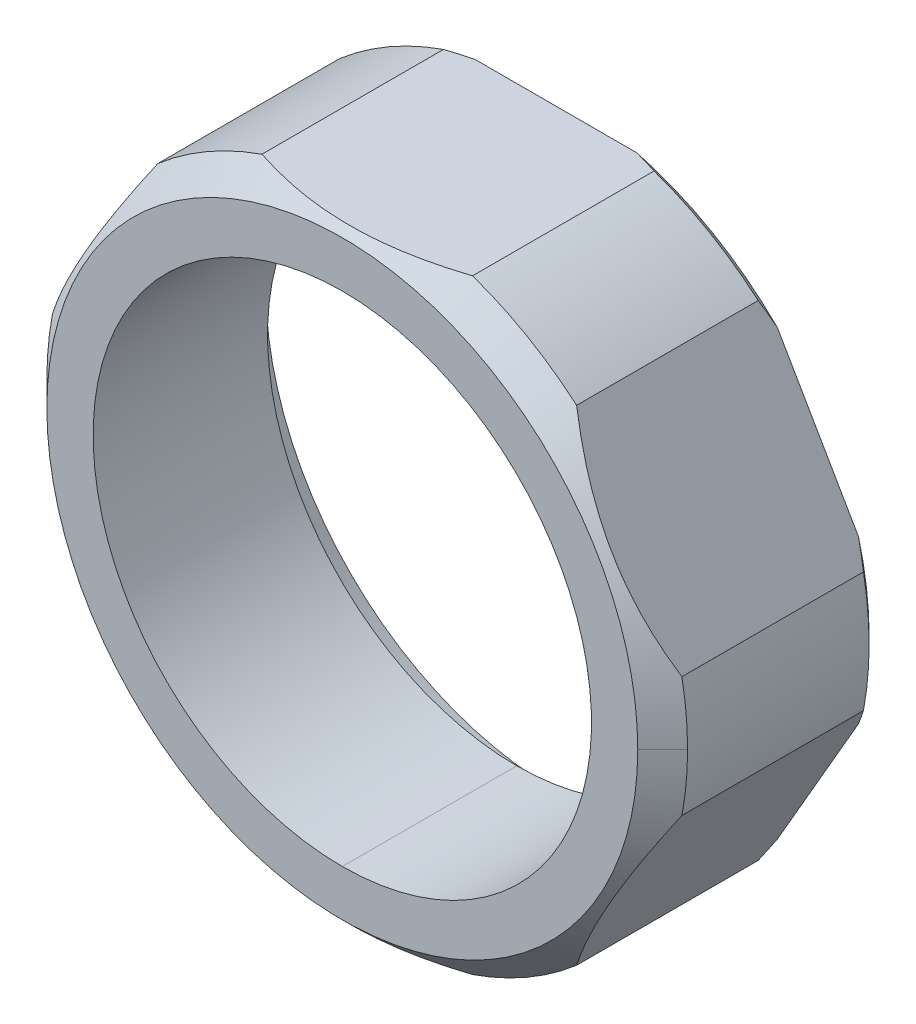
ISO-10303-21;
HEADER;
FILE_DESCRIPTION(('STEP AP214'),'2;1');
FILE_NAME('part.step','',(''),(''),'','','');
FILE_SCHEMA(('AUTOMOTIVE_DESIGN { 1 0 10303 214 1 1 1 1 }'));
ENDSEC;
DATA;
#1=APPLICATION_CONTEXT('core data for automotive mechanical design processes');
#2=APPLICATION_PROTOCOL_DEFINITION('international standard','automotive_design',2000,#1);
#3=PRODUCT_CONTEXT('',#1,'mechanical');
#4=PRODUCT('Part','Part','',(#3));
#5=PRODUCT_RELATED_PRODUCT_CATEGORY('part','',(#4));
#6=PRODUCT_DEFINITION_FORMATION('','',#4);
#7=PRODUCT_DEFINITION_CONTEXT('part definition',#1,'design');
#8=PRODUCT_DEFINITION('design','',#6,#7);
#9=PRODUCT_DEFINITION_SHAPE('','',#8);
#10=(LENGTH_UNIT() NAMED_UNIT(*) SI_UNIT(.MILLI.,.METRE.));
#11=(NAMED_UNIT(*) PLANE_ANGLE_UNIT() SI_UNIT($,.RADIAN.));
#12=(NAMED_UNIT(*) SI_UNIT($,.STERADIAN.) SOLID_ANGLE_UNIT());
#13=UNCERTAINTY_MEASURE_WITH_UNIT(LENGTH_MEASURE(1.E-05),#10,'distance_accuracy_value','');
#14=(GEOMETRIC_REPRESENTATION_CONTEXT(3) GLOBAL_UNCERTAINTY_ASSIGNED_CONTEXT((#13)) GLOBAL_UNIT_ASSIGNED_CONTEXT((#10,
#11,#12)) REPRESENTATION_CONTEXT('',''));
#15=CARTESIAN_POINT('',(0.,0.,0.));
#16=DIRECTION('',(0.,0.,1.));
#17=DIRECTION('',(1.,0.,0.));
#18=AXIS2_PLACEMENT_3D('',#15,#16,#17);
#19=CARTESIAN_POINT('',(0.,0.,-5.45));
#20=DIRECTION('',(0.,0.,-1.));
#21=DIRECTION('',(0.,-1.,0.));
#22=AXIS2_PLACEMENT_3D('',#19,#20,#21);
#23=CONICAL_SURFACE('',#22,8.025,0.223476601140647);
#24=DIRECTION('',(0.,0.22162110358899,-0.975132855791455));
#25=VECTOR('',#24,1.);
#26=CARTESIAN_POINT('',(0.,7.9,-4.9));
#27=LINE('',#26,#25);
#28=CARTESIAN_POINT('',(0.,7.9,-4.9));
#29=VERTEX_POINT('',#28);
#30=CARTESIAN_POINT('',(0.,8.15,-6.));
#31=VERTEX_POINT('',#30);
#32=EDGE_CURVE('E447',#29,#31,#27,.T.);
#33=ORIENTED_EDGE('',*,*,#32,.F.);
#34=CARTESIAN_POINT('',(0.,0.,-4.9));
#35=DIRECTION('',(0.,0.,-1.));
#36=DIRECTION('',(0.,-1.,0.));
#37=AXIS2_PLACEMENT_3D('',#34,#35,#36);
#38=CIRCLE('',#37,7.9);
#39=CARTESIAN_POINT('',(0.,-7.9,-4.9));
#40=VERTEX_POINT('',#39);
#41=EDGE_CURVE('E422',#40,#29,#38,.T.);
#42=ORIENTED_EDGE('',*,*,#41,.F.);
#43=DIRECTION('',(0.,-0.22162110358899,-0.975132855791455));
#44=VECTOR('',#43,1.);
#45=CARTESIAN_POINT('',(0.,-7.9,-4.9));
#46=LINE('',#45,#44);
#47=CARTESIAN_POINT('',(0.,-8.15,-6.));
#48=VERTEX_POINT('',#47);
#49=EDGE_CURVE('E421',#40,#48,#46,.T.);
#50=ORIENTED_EDGE('',*,*,#49,.T.);
#51=CARTESIAN_POINT('',(0.,0.,-6.));
#52=DIRECTION('',(0.,0.,-1.));
#53=DIRECTION('',(0.,-1.,0.));
#54=AXIS2_PLACEMENT_3D('',#51,#52,#53);
#55=CIRCLE('',#54,8.15);
#56=EDGE_CURVE('E505',#48,#31,#55,.T.);
#57=ORIENTED_EDGE('',*,*,#56,.T.);
#58=EDGE_LOOP('',(#33,#42,#50,#57));
#59=FACE_BOUND('',#58,.T.);
#60=ADVANCED_FACE('F17',(#59),#23,.F.);
#61=CARTESIAN_POINT('',(-2.95803989155,8.5,0.));
#62=DIRECTION('',(0.,-1.,0.));
#63=DIRECTION('',(0.,0.,-1.));
#64=AXIS2_PLACEMENT_3D('',#61,#62,#63);
#65=PLANE('',#64);
#66=DIRECTION('',(0.,0.,-1.));
#67=VECTOR('',#66,1.);
#68=CARTESIAN_POINT('',(2.95803989155,8.5,-0.7));
#69=LINE('',#68,#67);
#70=CARTESIAN_POINT('',(2.95803989155,8.5,-0.7));
#71=VERTEX_POINT('',#70);
#72=CARTESIAN_POINT('',(2.95803989155,8.5,-5.8));
#73=VERTEX_POINT('',#72);
#74=EDGE_CURVE('E290',#71,#73,#69,.T.);
#75=ORIENTED_EDGE('',*,*,#74,.T.);
#76=CARTESIAN_POINT('',(2.278157149979,8.5,-6.));
#77=CARTESIAN_POINT('',(2.352907056173,8.5,-5.980648632584));
#78=CARTESIAN_POINT('',(2.502933065639,8.5,-5.940031277948));
#79=CARTESIAN_POINT('',(2.729399049122,8.5,-5.873410688425));
#80=CARTESIAN_POINT('',(2.881633655516,8.5,-5.825112521572));
#81=CARTESIAN_POINT('',(2.95803989155,8.5,-5.8));
#82=(BOUNDED_CURVE() B_SPLINE_CURVE(3,(#76,#77,#78,#79,#80,#81),.UNSPECIFIED.,.F.,
.F.) B_SPLINE_CURVE_WITH_KNOTS((4,1,1,4),(0.,0.3333333333333,0.6666666666667,1.),
.UNSPECIFIED.) CURVE() GEOMETRIC_REPRESENTATION_ITEM() RATIONAL_B_SPLINE_CURVE((1.,1.,1.,1.,1.,1.)) REPRESENTATION_ITEM(''));
#83=CARTESIAN_POINT('',(2.278157149979,8.5,-6.));
#84=VERTEX_POINT('',#83);
#85=EDGE_CURVE('E485',#84,#73,#82,.T.);
#86=ORIENTED_EDGE('',*,*,#85,.F.);
#87=DIRECTION('',(1.,0.,0.));
#88=VECTOR('',#87,1.);
#89=CARTESIAN_POINT('',(-2.278157149979,8.5,-6.));
#90=LINE('',#89,#88);
#91=CARTESIAN_POINT('',(-2.278157149979,8.5,-6.));
#92=VERTEX_POINT('',#91);
#93=EDGE_CURVE('E396',#92,#84,#90,.T.);
#94=ORIENTED_EDGE('',*,*,#93,.F.);
#95=CARTESIAN_POINT('',(-2.95803989155,8.5,-5.8));
#96=CARTESIAN_POINT('',(-2.881606480556,8.5,-5.825121453196));
#97=CARTESIAN_POINT('',(-2.729335310098,8.5,-5.873430376536));
#98=CARTESIAN_POINT('',(-2.502872216259,8.5,-5.940048251835));
#99=CARTESIAN_POINT('',(-2.352880866275,8.5,-5.980655412665));
#100=CARTESIAN_POINT('',(-2.278157149979,8.5,-6.));
#101=(BOUNDED_CURVE() B_SPLINE_CURVE(3,(#95,#96,#97,#98,#99,#100),.UNSPECIFIED.,.F.,
.F.) B_SPLINE_CURVE_WITH_KNOTS((4,1,1,4),(0.,0.3333333333333,0.6666666666667,1.),
.UNSPECIFIED.) CURVE() GEOMETRIC_REPRESENTATION_ITEM() RATIONAL_B_SPLINE_CURVE((1.,1.,1.,1.,1.,1.)) REPRESENTATION_ITEM(''));
#102=CARTESIAN_POINT('',(-2.95803989155,8.5,-5.8));
#103=VERTEX_POINT('',#102);
#104=EDGE_CURVE('E394',#103,#92,#101,.T.);
#105=ORIENTED_EDGE('',*,*,#104,.F.);
#106=DIRECTION('',(0.,0.,-1.));
#107=VECTOR('',#106,1.);
#108=CARTESIAN_POINT('',(-2.95803989155,8.5,-0.7));
#109=LINE('',#108,#107);
#110=CARTESIAN_POINT('',(-2.95803989155,8.5,-0.7));
#111=VERTEX_POINT('',#110);
#112=EDGE_CURVE('E28',#111,#103,#109,.T.);
#113=ORIENTED_EDGE('',*,*,#112,.F.);
#114=CARTESIAN_POINT('',(-2.95803989155,8.5,-0.7));
#115=CARTESIAN_POINT('',(-2.19200036439627,8.5,-0.448224946686156));
#116=CARTESIAN_POINT('',(-1.45843124406096,8.5,-0.324191918908603));
#117=CARTESIAN_POINT('',(-0.724071352409175,8.5,-0.200025186265424));
#118=CARTESIAN_POINT('',(0.000155132986670234,8.5,-0.199992128847245));
#119=CARTESIAN_POINT('',(0.723284600410315,8.5,-0.199959121502604));
#120=CARTESIAN_POINT('',(1.45864079223674,8.5,-0.324226781885833));
#121=CARTESIAN_POINT('',(2.19157506313131,8.5,-0.448085162451768));
#122=CARTESIAN_POINT('',(2.95803989155,8.5,-0.7));
#123=B_SPLINE_CURVE_WITH_KNOTS('',2,(#114,#115,#116,#117,#118,#119,#120,#121,#122),
.UNSPECIFIED.,.F.,.F.,(3,2,2,2,3),(0.,0.25,0.5,0.75,1.),.UNSPECIFIED.);
#124=EDGE_CURVE('E321',#111,#71,#123,.T.);
#125=ORIENTED_EDGE('',*,*,#124,.T.);
#126=EDGE_LOOP('',(#75,#86,#94,#105,#113,#125));
#127=FACE_BOUND('',#126,.T.);
#128=ADVANCED_FACE('F256',(#127),#65,.F.);
#129=CARTESIAN_POINT('',(-8.840235877943,1.68826230851,0.));
#130=DIRECTION('',(0.866025403784429,-0.500000000000017,0.));
#131=DIRECTION('',(0.,0.,-1.));
#132=AXIS2_PLACEMENT_3D('',#129,#130,#131);
#133=PLANE('',#132);
#134=DIRECTION('',(0.,0.,-1.));
#135=VECTOR('',#134,1.);
#136=CARTESIAN_POINT('',(-5.882195986393,6.81173769149,-0.7));
#137=LINE('',#136,#135);
#138=CARTESIAN_POINT('',(-5.882195986393,6.81173769149,-0.7));
#139=VERTEX_POINT('',#138);
#140=CARTESIAN_POINT('',(-5.882195986393,6.81173769149,-5.8));
#141=VERTEX_POINT('',#140);
#142=EDGE_CURVE('E11',#139,#141,#137,.T.);
#143=ORIENTED_EDGE('',*,*,#142,.T.);
#144=CARTESIAN_POINT('',(-6.222137357178,6.222941965695,-6.));
#145=CARTESIAN_POINT('',(-6.184762404081,6.28767728339,-5.980648632584));
#146=CARTESIAN_POINT('',(-6.109749399348,6.417603618815,-5.940031277948));
#147=CARTESIAN_POINT('',(-5.996516407607,6.613728913605,-5.873410688425));
#148=CARTESIAN_POINT('',(-5.92039910441,6.745567950077,-5.825112521572));
#149=CARTESIAN_POINT('',(-5.882195986393,6.81173769149,-5.8));
#150=(BOUNDED_CURVE() B_SPLINE_CURVE(3,(#144,#145,#146,#147,#148,#149),.UNSPECIFIED.,.F.,
.F.) B_SPLINE_CURVE_WITH_KNOTS((4,1,1,4),(0.,0.3333333333333,0.6666666666667,1.),
.UNSPECIFIED.) CURVE() GEOMETRIC_REPRESENTATION_ITEM() RATIONAL_B_SPLINE_CURVE((1.,1.,1.,1.,1.,1.)) REPRESENTATION_ITEM(''));
#151=CARTESIAN_POINT('',(-6.222137357178,6.222941965695,-6.));
#152=VERTEX_POINT('',#151);
#153=EDGE_CURVE('E405',#152,#141,#150,.T.);
#154=ORIENTED_EDGE('',*,*,#153,.F.);
#155=DIRECTION('',(0.500000000000017,0.866025403784429,0.));
#156=VECTOR('',#155,1.);
#157=CARTESIAN_POINT('',(-8.500294507157,2.277058034305,-6.));
#158=LINE('',#157,#156);
#159=CARTESIAN_POINT('',(-8.500294507157,2.277058034305,-6.));
#160=VERTEX_POINT('',#159);
#161=EDGE_CURVE('E518',#160,#152,#158,.T.);
#162=ORIENTED_EDGE('',*,*,#161,.F.);
#163=CARTESIAN_POINT('',(-8.840235877943,1.68826230851,-5.8));
#164=CARTESIAN_POINT('',(-8.802019172446,1.754455584129,-5.825121453196));
#165=CARTESIAN_POINT('',(-8.725883587216,1.88632628601,-5.873430376536));
#166=CARTESIAN_POINT('',(-8.612652040297,2.082449078293,-5.940048251835));
#167=CARTESIAN_POINT('',(-8.537656365305,2.212345397728,-5.980655412665));
#168=CARTESIAN_POINT('',(-8.500294507157,2.277058034305,-6.));
#169=(BOUNDED_CURVE() B_SPLINE_CURVE(3,(#163,#164,#165,#166,#167,#168),.UNSPECIFIED.,.F.,
.F.) B_SPLINE_CURVE_WITH_KNOTS((4,1,1,4),(0.,0.3333333333333,0.6666666666667,1.),
.UNSPECIFIED.) CURVE() GEOMETRIC_REPRESENTATION_ITEM() RATIONAL_B_SPLINE_CURVE((1.,1.,1.,1.,1.,1.)) REPRESENTATION_ITEM(''));
#170=CARTESIAN_POINT('',(-8.840235877943,1.68826230851,-5.8));
#171=VERTEX_POINT('',#170);
#172=EDGE_CURVE('E510',#171,#160,#169,.T.);
#173=ORIENTED_EDGE('',*,*,#172,.F.);
#174=DIRECTION('',(0.,0.,-1.));
#175=VECTOR('',#174,1.);
#176=CARTESIAN_POINT('',(-8.840235877943,1.68826230851,-0.7));
#177=LINE('',#176,#175);
#178=CARTESIAN_POINT('',(-8.840235877943,1.68826230851,-0.7));
#179=VERTEX_POINT('',#178);
#180=EDGE_CURVE('E218',#179,#171,#177,.T.);
#181=ORIENTED_EDGE('',*,*,#180,.F.);
#182=CARTESIAN_POINT('',(-8.840235877943,1.68826230851,-0.7));
#183=CARTESIAN_POINT('',(-8.45721611436658,2.35167199932734,-0.44822494668627));
#184=CARTESIAN_POINT('',(-8.09043155419866,2.98696149296996,-0.324191918908603));
#185=CARTESIAN_POINT('',(-7.72325160837283,3.62293581466065,-0.200025186265424));
#186=CARTESIAN_POINT('',(-7.36113836567474,4.25013434910724,-0.199992128847245));
#187=CARTESIAN_POINT('',(-6.99957363196247,4.87638283812197,-0.199959121502604));
#188=CARTESIAN_POINT('',(-6.63189553604956,5.51321998107328,-0.324226781885833));
#189=CARTESIAN_POINT('',(-6.26542840060295,6.14795967897101,-0.448085162451644));
#190=CARTESIAN_POINT('',(-5.88219598639295,6.81173769148998,-0.7));
#191=B_SPLINE_CURVE_WITH_KNOTS('',2,(#182,#183,#184,#185,#186,#187,#188,#189,#190),
.UNSPECIFIED.,.F.,.F.,(3,2,2,2,3),(0.,0.25,0.5,0.75,1.),.UNSPECIFIED.);
#192=EDGE_CURVE('E238',#179,#139,#191,.T.);
#193=ORIENTED_EDGE('',*,*,#192,.T.);
#194=EDGE_LOOP('',(#143,#154,#162,#173,#181,#193));
#195=FACE_BOUND('',#194,.T.);
#196=ADVANCED_FACE('F245',(#195),#133,.F.);
#197=CARTESIAN_POINT('',(-5.882195986393,-6.81173769149,0.));
#198=DIRECTION('',(0.866025403784429,0.500000000000017,0.));
#199=DIRECTION('',(0.,0.,-1.));
#200=AXIS2_PLACEMENT_3D('',#197,#198,#199);
#201=PLANE('',#200);
#202=DIRECTION('',(0.,0.,-1.));
#203=VECTOR('',#202,1.);
#204=CARTESIAN_POINT('',(-8.840235877943,-1.68826230851,-0.7));
#205=LINE('',#204,#203);
#206=CARTESIAN_POINT('',(-8.840235877943,-1.68826230851,-0.7));
#207=VERTEX_POINT('',#206);
#208=CARTESIAN_POINT('',(-8.840235877943,-1.68826230851,-5.8));
#209=VERTEX_POINT('',#208);
#210=EDGE_CURVE('E221',#207,#209,#205,.T.);
#211=ORIENTED_EDGE('',*,*,#210,.T.);
#212=CARTESIAN_POINT('',(-8.500294507157,-2.277058034305,-6.));
#213=CARTESIAN_POINT('',(-8.537669460254,-2.21232271661,-5.980648632584));
#214=CARTESIAN_POINT('',(-8.612682464987,-2.082396381185,-5.940031277948));
#215=CARTESIAN_POINT('',(-8.725915456729,-1.886271086395,-5.873410688425));
#216=CARTESIAN_POINT('',(-8.802032759926,-1.754432049923,-5.825112521572));
#217=CARTESIAN_POINT('',(-8.840235877943,-1.68826230851,-5.8));
#218=(BOUNDED_CURVE() B_SPLINE_CURVE(3,(#212,#213,#214,#215,#216,#217),.UNSPECIFIED.,.F.,
.F.) B_SPLINE_CURVE_WITH_KNOTS((4,1,1,4),(0.,0.3333333333333,0.6666666666667,1.),
.UNSPECIFIED.) CURVE() GEOMETRIC_REPRESENTATION_ITEM() RATIONAL_B_SPLINE_CURVE((1.,1.,1.,1.,1.,1.)) REPRESENTATION_ITEM(''));
#219=CARTESIAN_POINT('',(-8.500294507157,-2.277058034305,-6.));
#220=VERTEX_POINT('',#219);
#221=EDGE_CURVE('E653',#220,#209,#218,.T.);
#222=ORIENTED_EDGE('',*,*,#221,.F.);
#223=DIRECTION('',(-0.500000000000017,0.866025403784429,0.));
#224=VECTOR('',#223,1.);
#225=CARTESIAN_POINT('',(-6.222137357178,-6.222941965695,-6.));
#226=LINE('',#225,#224);
#227=CARTESIAN_POINT('',(-6.222137357178,-6.222941965695,-6.));
#228=VERTEX_POINT('',#227);
#229=EDGE_CURVE('E440',#228,#220,#226,.T.);
#230=ORIENTED_EDGE('',*,*,#229,.F.);
#231=CARTESIAN_POINT('',(-5.882195986393,-6.81173769149,-5.8));
#232=CARTESIAN_POINT('',(-5.92041269189,-6.745544415871,-5.825121453196));
#233=CARTESIAN_POINT('',(-5.996548277119,-6.61367371399,-5.873430376536));
#234=CARTESIAN_POINT('',(-6.109779824038,-6.417550921707,-5.940048251835));
#235=CARTESIAN_POINT('',(-6.18477549903,-6.287654602272,-5.980655412665));
#236=CARTESIAN_POINT('',(-6.222137357178,-6.222941965695,-6.));
#237=(BOUNDED_CURVE() B_SPLINE_CURVE(3,(#231,#232,#233,#234,#235,#236),.UNSPECIFIED.,.F.,
.F.) B_SPLINE_CURVE_WITH_KNOTS((4,1,1,4),(0.,0.3333333333333,0.6666666666667,1.),
.UNSPECIFIED.) CURVE() GEOMETRIC_REPRESENTATION_ITEM() RATIONAL_B_SPLINE_CURVE((1.,1.,1.,1.,1.,1.)) REPRESENTATION_ITEM(''));
#238=CARTESIAN_POINT('',(-5.882195986393,-6.81173769149,-5.8));
#239=VERTEX_POINT('',#238);
#240=EDGE_CURVE('E503',#239,#228,#237,.T.);
#241=ORIENTED_EDGE('',*,*,#240,.F.);
#242=DIRECTION('',(0.,0.,-1.));
#243=VECTOR('',#242,1.);
#244=CARTESIAN_POINT('',(-5.882195986393,-6.81173769149,-0.7));
#245=LINE('',#244,#243);
#246=CARTESIAN_POINT('',(-5.882195986393,-6.81173769149,-0.7));
#247=VERTEX_POINT('',#246);
#248=EDGE_CURVE('E209',#247,#239,#245,.T.);
#249=ORIENTED_EDGE('',*,*,#248,.F.);
#250=CARTESIAN_POINT('',(-5.882195986393,-6.81173769149,-0.7));
#251=CARTESIAN_POINT('',(-6.26521574996983,-6.14832800067194,-0.448224946685998));
#252=CARTESIAN_POINT('',(-6.63200031013719,-5.5130385070303,-0.324191918908603));
#253=CARTESIAN_POINT('',(-6.99918025596325,-4.8770641853392,-0.200025186265424));
#254=CARTESIAN_POINT('',(-7.36129349866113,-4.24986565089298,-0.199992128847245));
#255=CARTESIAN_POINT('',(-7.72285823237328,-3.62361716187846,-0.199959121502604));
#256=CARTESIAN_POINT('',(-8.09053632828619,-2.98678001892715,-0.324226781885833));
#257=CARTESIAN_POINT('',(-8.45700346373331,-2.35204032102853,-0.448085162451818));
#258=CARTESIAN_POINT('',(-8.84023587794305,-1.68826230851002,-0.7));
#259=B_SPLINE_CURVE_WITH_KNOTS('',2,(#250,#251,#252,#253,#254,#255,#256,#257,#258),
.UNSPECIFIED.,.F.,.F.,(3,2,2,2,3),(0.,0.25,0.5,0.75,1.),.UNSPECIFIED.);
#260=EDGE_CURVE('E229',#247,#207,#259,.T.);
#261=ORIENTED_EDGE('',*,*,#260,.T.);
#262=EDGE_LOOP('',(#211,#222,#230,#241,#249,#261));
#263=FACE_BOUND('',#262,.T.);
#264=ADVANCED_FACE('F255',(#263),#201,.F.);
#265=CARTESIAN_POINT('',(0.,0.,0.3));
#266=DIRECTION('',(0.,0.,-1.));
#267=DIRECTION('',(0.,-1.,0.));
#268=AXIS2_PLACEMENT_3D('',#265,#266,#267);
#269=CYLINDRICAL_SURFACE('',#268,9.);
#270=ORIENTED_EDGE('',*,*,#112,.T.);
#271=CARTESIAN_POINT('',(0.,0.,-5.8));
#272=DIRECTION('',(0.,0.,-1.));
#273=DIRECTION('',(-0.6535773318214,0.7568597434989,0.));
#274=AXIS2_PLACEMENT_3D('',#271,#272,#273);
#275=CIRCLE('',#274,9.);
#276=EDGE_CURVE('E388',#141,#103,#275,.T.);
#277=ORIENTED_EDGE('',*,*,#276,.F.);
#278=ORIENTED_EDGE('',*,*,#142,.F.);
#279=CARTESIAN_POINT('',(0.,0.,-0.7));
#280=DIRECTION('',(0.,0.,-1.));
#281=DIRECTION('',(-0.6535773318214,0.7568597434989,0.));
#282=AXIS2_PLACEMENT_3D('',#279,#280,#281);
#283=CIRCLE('',#282,9.);
#284=EDGE_CURVE('E390',#139,#111,#283,.T.);
#285=ORIENTED_EDGE('',*,*,#284,.T.);
#286=EDGE_LOOP('',(#270,#277,#278,#285));
#287=FACE_BOUND('',#286,.T.);
#288=ADVANCED_FACE('F268',(#287),#269,.T.);
#289=CARTESIAN_POINT('',(0.,0.,0.3));
#290=DIRECTION('',(0.,0.,-1.));
#291=DIRECTION('',(0.,-1.,0.));
#292=AXIS2_PLACEMENT_3D('',#289,#290,#291);
#293=CYLINDRICAL_SURFACE('',#292,9.);
#294=CARTESIAN_POINT('',(0.,0.,-0.7));
#295=DIRECTION('',(0.,0.,-1.));
#296=DIRECTION('',(-1.,0.,0.));
#297=AXIS2_PLACEMENT_3D('',#294,#295,#296);
#298=CIRCLE('',#297,9.);
#299=CARTESIAN_POINT('',(-9.,0.,-0.7));
#300=VERTEX_POINT('',#299);
#301=EDGE_CURVE('E451',#300,#179,#298,.T.);
#302=ORIENTED_EDGE('',*,*,#301,.T.);
#303=ORIENTED_EDGE('',*,*,#180,.T.);
#304=CARTESIAN_POINT('',(0.,0.,-5.8));
#305=DIRECTION('',(0.,0.,1.));
#306=DIRECTION('',(-0.982248430882508,0.187584700945602,0.));
#307=AXIS2_PLACEMENT_3D('',#304,#305,#306);
#308=CIRCLE('',#307,9.);
#309=EDGE_CURVE('E517',#171,#209,#308,.T.);
#310=ORIENTED_EDGE('',*,*,#309,.T.);
#311=ORIENTED_EDGE('',*,*,#210,.F.);
#312=CARTESIAN_POINT('',(0.,0.,-0.7));
#313=DIRECTION('',(0.,0.,-1.));
#314=DIRECTION('',(-0.982248430882508,-0.187584700945602,0.));
#315=AXIS2_PLACEMENT_3D('',#312,#313,#314);
#316=CIRCLE('',#315,9.);
#317=EDGE_CURVE('E226',#207,#300,#316,.T.);
#318=ORIENTED_EDGE('',*,*,#317,.T.);
#319=EDGE_LOOP('',(#302,#303,#310,#311,#318));
#320=FACE_BOUND('',#319,.T.);
#321=ADVANCED_FACE('F19',(#320),#293,.T.);
#322=CARTESIAN_POINT('',(0.,0.,0.3));
#323=DIRECTION('',(0.,0.,-1.));
#324=DIRECTION('',(0.,-1.,0.));
#325=AXIS2_PLACEMENT_3D('',#322,#323,#324);
#326=CYLINDRICAL_SURFACE('',#325,9.);
#327=ORIENTED_EDGE('',*,*,#248,.T.);
#328=CARTESIAN_POINT('',(0.,0.,-5.8));
#329=DIRECTION('',(0.,0.,-1.));
#330=DIRECTION('',(-0.328671099061113,-0.944444444444437,0.));
#331=AXIS2_PLACEMENT_3D('',#328,#329,#330);
#332=CIRCLE('',#331,9.);
#333=CARTESIAN_POINT('',(-2.95803989155,-8.5,-5.8));
#334=VERTEX_POINT('',#333);
#335=EDGE_CURVE('E497',#334,#239,#332,.T.);
#336=ORIENTED_EDGE('',*,*,#335,.F.);
#337=DIRECTION('',(0.,0.,-1.));
#338=VECTOR('',#337,1.);
#339=CARTESIAN_POINT('',(-2.95803989155,-8.5,-0.7));
#340=LINE('',#339,#338);
#341=CARTESIAN_POINT('',(-2.95803989155,-8.5,-0.7));
#342=VERTEX_POINT('',#341);
#343=EDGE_CURVE('E133',#342,#334,#340,.T.);
#344=ORIENTED_EDGE('',*,*,#343,.F.);
#345=CARTESIAN_POINT('',(0.,0.,-0.7));
#346=DIRECTION('',(0.,0.,-1.));
#347=DIRECTION('',(-0.328671099061113,-0.944444444444437,0.));
#348=AXIS2_PLACEMENT_3D('',#345,#346,#347);
#349=CIRCLE('',#348,9.);
#350=EDGE_CURVE('E169',#342,#247,#349,.T.);
#351=ORIENTED_EDGE('',*,*,#350,.T.);
#352=EDGE_LOOP('',(#327,#336,#344,#351));
#353=FACE_BOUND('',#352,.T.);
#354=ADVANCED_FACE('F257',(#353),#326,.T.);
#355=CARTESIAN_POINT('',(2.95803989155,-8.5,0.));
#356=DIRECTION('',(0.,1.,0.));
#357=DIRECTION('',(1.,0.,0.));
#358=AXIS2_PLACEMENT_3D('',#355,#356,#357);
#359=PLANE('',#358);
#360=ORIENTED_EDGE('',*,*,#343,.T.);
#361=CARTESIAN_POINT('',(-2.278157149979,-8.5,-6.));
#362=CARTESIAN_POINT('',(-2.352907056173,-8.5,-5.980648632584));
#363=CARTESIAN_POINT('',(-2.502933065639,-8.5,-5.940031277948));
#364=CARTESIAN_POINT('',(-2.729399049122,-8.5,-5.873410688425));
#365=CARTESIAN_POINT('',(-2.881633655516,-8.5,-5.825112521572));
#366=CARTESIAN_POINT('',(-2.95803989155,-8.5,-5.8));
#367=(BOUNDED_CURVE() B_SPLINE_CURVE(3,(#361,#362,#363,#364,#365,#366),.UNSPECIFIED.,.F.,
.F.) B_SPLINE_CURVE_WITH_KNOTS((4,1,1,4),(0.,0.3333333333333,0.6666666666667,1.),
.UNSPECIFIED.) CURVE() GEOMETRIC_REPRESENTATION_ITEM() RATIONAL_B_SPLINE_CURVE((1.,1.,1.,1.,1.,1.)) REPRESENTATION_ITEM(''));
#368=CARTESIAN_POINT('',(-2.278157149979,-8.5,-6.));
#369=VERTEX_POINT('',#368);
#370=EDGE_CURVE('E504',#369,#334,#367,.T.);
#371=ORIENTED_EDGE('',*,*,#370,.F.);
#372=DIRECTION('',(-1.,0.,0.));
#373=VECTOR('',#372,1.);
#374=CARTESIAN_POINT('',(2.278157149979,-8.5,-6.));
#375=LINE('',#374,#373);
#376=CARTESIAN_POINT('',(2.278157149979,-8.5,-6.));
#377=VERTEX_POINT('',#376);
#378=EDGE_CURVE('E441',#377,#369,#375,.T.);
#379=ORIENTED_EDGE('',*,*,#378,.F.);
#380=CARTESIAN_POINT('',(2.95803989155,-8.5,-5.8));
#381=CARTESIAN_POINT('',(2.881606480556,-8.5,-5.825121453196));
#382=CARTESIAN_POINT('',(2.729335310098,-8.5,-5.873430376536));
#383=CARTESIAN_POINT('',(2.502872216259,-8.5,-5.940048251835));
#384=CARTESIAN_POINT('',(2.352880866275,-8.5,-5.980655412665));
#385=CARTESIAN_POINT('',(2.278157149979,-8.5,-6.));
#386=(BOUNDED_CURVE() B_SPLINE_CURVE(3,(#380,#381,#382,#383,#384,#385),.UNSPECIFIED.,.F.,
.F.) B_SPLINE_CURVE_WITH_KNOTS((4,1,1,4),(0.,0.3333333333333,0.6666666666667,1.),
.UNSPECIFIED.) CURVE() GEOMETRIC_REPRESENTATION_ITEM() RATIONAL_B_SPLINE_CURVE((1.,1.,1.,1.,1.,1.)) REPRESENTATION_ITEM(''));
#387=CARTESIAN_POINT('',(2.95803989155,-8.5,-5.8));
#388=VERTEX_POINT('',#387);
#389=EDGE_CURVE('E150',#388,#377,#386,.T.);
#390=ORIENTED_EDGE('',*,*,#389,.F.);
#391=DIRECTION('',(0.,0.,-1.));
#392=VECTOR('',#391,1.);
#393=CARTESIAN_POINT('',(2.95803989155,-8.5,-0.7));
#394=LINE('',#393,#392);
#395=CARTESIAN_POINT('',(2.95803989155,-8.5,-0.7));
#396=VERTEX_POINT('',#395);
#397=EDGE_CURVE('E141',#396,#388,#394,.T.);
#398=ORIENTED_EDGE('',*,*,#397,.F.);
#399=CARTESIAN_POINT('',(2.95803989155,-8.5,-0.7));
#400=CARTESIAN_POINT('',(2.19200036439627,-8.5,-0.448224946686156));
#401=CARTESIAN_POINT('',(1.45843124406096,-8.5,-0.324191918908603));
#402=CARTESIAN_POINT('',(0.724071352409175,-8.5,-0.200025186265424));
#403=CARTESIAN_POINT('',(-0.000155132986670234,-8.5,-0.199992128847245));
#404=CARTESIAN_POINT('',(-0.723284600410315,-8.5,-0.199959121502604));
#405=CARTESIAN_POINT('',(-1.45864079223674,-8.5,-0.324226781885833));
#406=CARTESIAN_POINT('',(-2.19157506313131,-8.5,-0.448085162451768));
#407=CARTESIAN_POINT('',(-2.95803989155,-8.5,-0.7));
#408=B_SPLINE_CURVE_WITH_KNOTS('',2,(#399,#400,#401,#402,#403,#404,#405,#406,#407),
.UNSPECIFIED.,.F.,.F.,(3,2,2,2,3),(0.,0.25,0.5,0.75,1.),.UNSPECIFIED.);
#409=EDGE_CURVE('E145',#396,#342,#408,.T.);
#410=ORIENTED_EDGE('',*,*,#409,.T.);
#411=EDGE_LOOP('',(#360,#371,#379,#390,#398,#410));
#412=FACE_BOUND('',#411,.T.);
#413=ADVANCED_FACE('F143',(#412),#359,.F.);
#414=CARTESIAN_POINT('',(8.840235877943,-1.68826230851,0.));
#415=DIRECTION('',(-0.866025403784429,0.500000000000017,0.));
#416=DIRECTION('',(0.,0.,1.));
#417=AXIS2_PLACEMENT_3D('',#414,#415,#416);
#418=PLANE('',#417);
#419=DIRECTION('',(0.,0.,-1.));
#420=VECTOR('',#419,1.);
#421=CARTESIAN_POINT('',(5.882195986393,-6.81173769149,-0.7));
#422=LINE('',#421,#420);
#423=CARTESIAN_POINT('',(5.882195986393,-6.81173769149,-0.7));
#424=VERTEX_POINT('',#423);
#425=CARTESIAN_POINT('',(5.882195986393,-6.81173769149,-5.8));
#426=VERTEX_POINT('',#425);
#427=EDGE_CURVE('E155',#424,#426,#422,.T.);
#428=ORIENTED_EDGE('',*,*,#427,.T.);
#429=CARTESIAN_POINT('',(6.222137357178,-6.222941965695,-6.));
#430=CARTESIAN_POINT('',(6.184762404081,-6.28767728339,-5.980648632584));
#431=CARTESIAN_POINT('',(6.109749399348,-6.417603618815,-5.940031277948));
#432=CARTESIAN_POINT('',(5.996516407607,-6.613728913605,-5.873410688425));
#433=CARTESIAN_POINT('',(5.92039910441,-6.745567950077,-5.825112521572));
#434=CARTESIAN_POINT('',(5.882195986393,-6.81173769149,-5.8));
#435=(BOUNDED_CURVE() B_SPLINE_CURVE(3,(#429,#430,#431,#432,#433,#434),.UNSPECIFIED.,.F.,
.F.) B_SPLINE_CURVE_WITH_KNOTS((4,1,1,4),(0.,0.3333333333333,0.6666666666667,1.),
.UNSPECIFIED.) CURVE() GEOMETRIC_REPRESENTATION_ITEM() RATIONAL_B_SPLINE_CURVE((1.,1.,1.,1.,1.,1.)) REPRESENTATION_ITEM(''));
#436=CARTESIAN_POINT('',(6.222137357178,-6.222941965695,-6.));
#437=VERTEX_POINT('',#436);
#438=EDGE_CURVE('E425',#437,#426,#435,.T.);
#439=ORIENTED_EDGE('',*,*,#438,.F.);
#440=DIRECTION('',(-0.500000000000017,-0.866025403784429,0.));
#441=VECTOR('',#440,1.);
#442=CARTESIAN_POINT('',(8.500294507157,-2.277058034305,-6.));
#443=LINE('',#442,#441);
#444=CARTESIAN_POINT('',(8.500294507157,-2.277058034305,-6.));
#445=VERTEX_POINT('',#444);
#446=EDGE_CURVE('E446',#445,#437,#443,.T.);
#447=ORIENTED_EDGE('',*,*,#446,.F.);
#448=CARTESIAN_POINT('',(8.840235877943,-1.68826230851,-5.8));
#449=CARTESIAN_POINT('',(8.802019172446,-1.754455584129,-5.825121453196));
#450=CARTESIAN_POINT('',(8.725883587216,-1.88632628601,-5.873430376536));
#451=CARTESIAN_POINT('',(8.612652040297,-2.082449078293,-5.940048251835));
#452=CARTESIAN_POINT('',(8.537656365305,-2.212345397728,-5.980655412665));
#453=CARTESIAN_POINT('',(8.500294507157,-2.277058034305,-6.));
#454=(BOUNDED_CURVE() B_SPLINE_CURVE(3,(#448,#449,#450,#451,#452,#453),.UNSPECIFIED.,.F.,
.F.) B_SPLINE_CURVE_WITH_KNOTS((4,1,1,4),(0.,0.3333333333333,0.6666666666667,1.),
.UNSPECIFIED.) CURVE() GEOMETRIC_REPRESENTATION_ITEM() RATIONAL_B_SPLINE_CURVE((1.,1.,1.,1.,1.,1.)) REPRESENTATION_ITEM(''));
#455=CARTESIAN_POINT('',(8.840235877943,-1.68826230851,-5.8));
#456=VERTEX_POINT('',#455);
#457=EDGE_CURVE('E401',#456,#445,#454,.T.);
#458=ORIENTED_EDGE('',*,*,#457,.F.);
#459=DIRECTION('',(0.,0.,-1.));
#460=VECTOR('',#459,1.);
#461=CARTESIAN_POINT('',(8.840235877943,-1.68826230851,-0.7));
#462=LINE('',#461,#460);
#463=CARTESIAN_POINT('',(8.840235877943,-1.68826230851,-0.7));
#464=VERTEX_POINT('',#463);
#465=EDGE_CURVE('E42',#464,#456,#462,.T.);
#466=ORIENTED_EDGE('',*,*,#465,.F.);
#467=CARTESIAN_POINT('',(8.840235877943,-1.68826230851,-0.7));
#468=CARTESIAN_POINT('',(8.45721611436658,-2.35167199932734,-0.44822494668627));
#469=CARTESIAN_POINT('',(8.09043155419866,-2.98696149296996,-0.324191918908603));
#470=CARTESIAN_POINT('',(7.72325160837283,-3.62293581466065,-0.200025186265424));
#471=CARTESIAN_POINT('',(7.36113836567474,-4.25013434910724,-0.199992128847245));
#472=CARTESIAN_POINT('',(6.99957363196247,-4.87638283812197,-0.199959121502604));
#473=CARTESIAN_POINT('',(6.63189553604956,-5.51321998107328,-0.324226781885833));
#474=CARTESIAN_POINT('',(6.26542840060295,-6.14795967897101,-0.448085162451644));
#475=CARTESIAN_POINT('',(5.88219598639295,-6.81173769148998,-0.7));
#476=B_SPLINE_CURVE_WITH_KNOTS('',2,(#467,#468,#469,#470,#471,#472,#473,#474,#475),
.UNSPECIFIED.,.F.,.F.,(3,2,2,2,3),(0.,0.25,0.5,0.75,1.),.UNSPECIFIED.);
#477=EDGE_CURVE('E163',#464,#424,#476,.T.);
#478=ORIENTED_EDGE('',*,*,#477,.T.);
#479=EDGE_LOOP('',(#428,#439,#447,#458,#466,#478));
#480=FACE_BOUND('',#479,.T.);
#481=ADVANCED_FACE('F563',(#480),#418,.F.);
#482=CARTESIAN_POINT('',(0.,0.,0.3));
#483=DIRECTION('',(0.,0.,-1.));
#484=DIRECTION('',(0.,-1.,0.));
#485=AXIS2_PLACEMENT_3D('',#482,#483,#484);
#486=CYLINDRICAL_SURFACE('',#485,9.);
#487=DIRECTION('',(0.,0.,-1.));
#488=VECTOR('',#487,1.);
#489=CARTESIAN_POINT('',(5.882195986393,6.81173769149,-0.7));
#490=LINE('',#489,#488);
#491=CARTESIAN_POINT('',(5.882195986393,6.81173769149,-0.7));
#492=VERTEX_POINT('',#491);
#493=CARTESIAN_POINT('',(5.882195986393,6.81173769149,-5.8));
#494=VERTEX_POINT('',#493);
#495=EDGE_CURVE('E349',#492,#494,#490,.T.);
#496=ORIENTED_EDGE('',*,*,#495,.T.);
#497=CARTESIAN_POINT('',(0.,0.,-5.8));
#498=DIRECTION('',(0.,0.,-1.));
#499=DIRECTION('',(0.328671099061113,0.944444444444437,0.));
#500=AXIS2_PLACEMENT_3D('',#497,#498,#499);
#501=CIRCLE('',#500,9.);
#502=EDGE_CURVE('E481',#73,#494,#501,.T.);
#503=ORIENTED_EDGE('',*,*,#502,.F.);
#504=ORIENTED_EDGE('',*,*,#74,.F.);
#505=CARTESIAN_POINT('',(0.,0.,-0.7));
#506=DIRECTION('',(0.,0.,-1.));
#507=DIRECTION('',(0.328671099061113,0.944444444444437,0.));
#508=AXIS2_PLACEMENT_3D('',#505,#506,#507);
#509=CIRCLE('',#508,9.);
#510=EDGE_CURVE('E318',#71,#492,#509,.T.);
#511=ORIENTED_EDGE('',*,*,#510,.T.);
#512=EDGE_LOOP('',(#496,#503,#504,#511));
#513=FACE_BOUND('',#512,.T.);
#514=ADVANCED_FACE('F571',(#513),#486,.T.);
#515=CARTESIAN_POINT('',(0.,0.,0.3));
#516=DIRECTION('',(0.,0.,-1.));
#517=DIRECTION('',(0.,-1.,0.));
#518=AXIS2_PLACEMENT_3D('',#515,#516,#517);
#519=CYLINDRICAL_SURFACE('',#518,9.);
#520=ORIENTED_EDGE('',*,*,#397,.T.);
#521=CARTESIAN_POINT('',(0.,0.,-5.8));
#522=DIRECTION('',(0.,0.,-1.));
#523=DIRECTION('',(0.6535773318214,-0.7568597434989,0.));
#524=AXIS2_PLACEMENT_3D('',#521,#522,#523);
#525=CIRCLE('',#524,9.);
#526=EDGE_CURVE('E430',#426,#388,#525,.T.);
#527=ORIENTED_EDGE('',*,*,#526,.F.);
#528=ORIENTED_EDGE('',*,*,#427,.F.);
#529=CARTESIAN_POINT('',(0.,0.,-0.7));
#530=DIRECTION('',(0.,0.,-1.));
#531=DIRECTION('',(0.6535773318214,-0.7568597434989,0.));
#532=AXIS2_PLACEMENT_3D('',#529,#530,#531);
#533=CIRCLE('',#532,9.);
#534=EDGE_CURVE('E158',#424,#396,#533,.T.);
#535=ORIENTED_EDGE('',*,*,#534,.T.);
#536=EDGE_LOOP('',(#520,#527,#528,#535));
#537=FACE_BOUND('',#536,.T.);
#538=ADVANCED_FACE('F159',(#537),#519,.T.);
#539=CARTESIAN_POINT('',(0.,0.,0.3));
#540=DIRECTION('',(0.,0.,-1.));
#541=DIRECTION('',(0.,-1.,0.));
#542=AXIS2_PLACEMENT_3D('',#539,#540,#541);
#543=CYLINDRICAL_SURFACE('',#542,9.);
#544=ORIENTED_EDGE('',*,*,#465,.T.);
#545=CARTESIAN_POINT('',(0.,0.,-5.8));
#546=DIRECTION('',(0.,0.,1.));
#547=DIRECTION('',(0.982248430882508,-0.187584700945602,0.));
#548=AXIS2_PLACEMENT_3D('',#545,#546,#547);
#549=CIRCLE('',#548,9.);
#550=CARTESIAN_POINT('',(8.840235877943,1.68826230851,-5.8));
#551=VERTEX_POINT('',#550);
#552=EDGE_CURVE('E423',#456,#551,#549,.T.);
#553=ORIENTED_EDGE('',*,*,#552,.T.);
#554=DIRECTION('',(0.,0.,-1.));
#555=VECTOR('',#554,1.);
#556=CARTESIAN_POINT('',(8.840235877943,1.68826230851,-0.7));
#557=LINE('',#556,#555);
#558=CARTESIAN_POINT('',(8.840235877943,1.68826230851,-0.7));
#559=VERTEX_POINT('',#558);
#560=EDGE_CURVE('E516',#559,#551,#557,.T.);
#561=ORIENTED_EDGE('',*,*,#560,.F.);
#562=CARTESIAN_POINT('',(0.,0.,-0.7));
#563=DIRECTION('',(0.,0.,-1.));
#564=DIRECTION('',(0.982248430882508,0.187584700945602,0.));
#565=AXIS2_PLACEMENT_3D('',#562,#563,#564);
#566=CIRCLE('',#565,9.);
#567=CARTESIAN_POINT('',(9.,0.,-0.7));
#568=VERTEX_POINT('',#567);
#569=EDGE_CURVE('E322',#559,#568,#566,.T.);
#570=ORIENTED_EDGE('',*,*,#569,.T.);
#571=CARTESIAN_POINT('',(0.,0.,-0.7));
#572=DIRECTION('',(0.,0.,-1.));
#573=DIRECTION('',(1.,0.,0.));
#574=AXIS2_PLACEMENT_3D('',#571,#572,#573);
#575=CIRCLE('',#574,9.);
#576=EDGE_CURVE('E854',#568,#464,#575,.T.);
#577=ORIENTED_EDGE('',*,*,#576,.T.);
#578=EDGE_LOOP('',(#544,#553,#561,#570,#577));
#579=FACE_BOUND('',#578,.T.);
#580=ADVANCED_FACE('F190',(#579),#543,.T.);
#581=CARTESIAN_POINT('',(0.,0.,-0.35));
#582=DIRECTION('',(0.,0.,-1.));
#583=DIRECTION('',(1.,0.,0.));
#584=AXIS2_PLACEMENT_3D('',#581,#582,#583);
#585=CONICAL_SURFACE('',#584,8.65,0.7853981633973);
#586=DIRECTION('',(0.707106781186548,0.,0.707106781186548));
#587=VECTOR('',#586,1.);
#588=CARTESIAN_POINT('',(-9.,0.,-0.7));
#589=LINE('',#588,#587);
#590=CARTESIAN_POINT('',(-8.3,0.,0.));
#591=VERTEX_POINT('',#590);
#592=EDGE_CURVE('E230',#300,#591,#589,.T.);
#593=ORIENTED_EDGE('',*,*,#592,.F.);
#594=ORIENTED_EDGE('',*,*,#317,.F.);
#595=ORIENTED_EDGE('',*,*,#260,.F.);
#596=ORIENTED_EDGE('',*,*,#350,.F.);
#597=ORIENTED_EDGE('',*,*,#409,.F.);
#598=ORIENTED_EDGE('',*,*,#534,.F.);
#599=ORIENTED_EDGE('',*,*,#477,.F.);
#600=ORIENTED_EDGE('',*,*,#576,.F.);
#601=DIRECTION('',(-0.707106781186548,0.,0.707106781186548));
#602=VECTOR('',#601,1.);
#603=CARTESIAN_POINT('',(9.,0.,-0.7));
#604=LINE('',#603,#602);
#605=CARTESIAN_POINT('',(8.3,0.,0.));
#606=VERTEX_POINT('',#605);
#607=EDGE_CURVE('E669',#568,#606,#604,.T.);
#608=ORIENTED_EDGE('',*,*,#607,.T.);
#609=CARTESIAN_POINT('',(0.,0.,0.));
#610=DIRECTION('',(0.,0.,-1.));
#611=DIRECTION('',(1.,0.,0.));
#612=AXIS2_PLACEMENT_3D('',#609,#610,#611);
#613=CIRCLE('',#612,8.3);
#614=EDGE_CURVE('E458',#606,#591,#613,.T.);
#615=ORIENTED_EDGE('',*,*,#614,.T.);
#616=EDGE_LOOP('',(#593,#594,#595,#596,#597,#598,#599,#600,#608,#615));
#617=FACE_BOUND('',#616,.T.);
#618=ADVANCED_FACE('F167',(#617),#585,.T.);
#619=CARTESIAN_POINT('',(0.,0.,-0.35));
#620=DIRECTION('',(0.,0.,-1.));
#621=DIRECTION('',(1.,0.,0.));
#622=AXIS2_PLACEMENT_3D('',#619,#620,#621);
#623=CONICAL_SURFACE('',#622,8.65,0.7853981633973);
#624=ORIENTED_EDGE('',*,*,#607,.F.);
#625=ORIENTED_EDGE('',*,*,#569,.F.);
#626=CARTESIAN_POINT('',(5.882195986393,6.81173769149,-0.7));
#627=CARTESIAN_POINT('',(6.26521574996983,6.14832800067194,-0.448224946685998));
#628=CARTESIAN_POINT('',(6.63200031013719,5.5130385070303,-0.324191918908603));
#629=CARTESIAN_POINT('',(6.99918025596325,4.8770641853392,-0.200025186265424));
#630=CARTESIAN_POINT('',(7.36129349866113,4.24986565089298,-0.199992128847246));
#631=CARTESIAN_POINT('',(7.72285823237328,3.62361716187846,-0.199959121502605));
#632=CARTESIAN_POINT('',(8.09053632828619,2.98678001892715,-0.324226781885833));
#633=CARTESIAN_POINT('',(8.45700346373331,2.35204032102853,-0.448085162451818));
#634=CARTESIAN_POINT('',(8.84023587794305,1.68826230851002,-0.7));
#635=B_SPLINE_CURVE_WITH_KNOTS('',2,(#626,#627,#628,#629,#630,#631,#632,#633,#634),
.UNSPECIFIED.,.F.,.F.,(3,2,2,2,3),(0.,0.25,0.5,0.75,1.),.UNSPECIFIED.);
#636=EDGE_CURVE('E331',#492,#559,#635,.T.);
#637=ORIENTED_EDGE('',*,*,#636,.F.);
#638=ORIENTED_EDGE('',*,*,#510,.F.);
#639=ORIENTED_EDGE('',*,*,#124,.F.);
#640=ORIENTED_EDGE('',*,*,#284,.F.);
#641=ORIENTED_EDGE('',*,*,#192,.F.);
#642=ORIENTED_EDGE('',*,*,#301,.F.);
#643=ORIENTED_EDGE('',*,*,#592,.T.);
#644=CARTESIAN_POINT('',(0.,0.,0.));
#645=DIRECTION('',(0.,0.,-1.));
#646=DIRECTION('',(-1.,0.,0.));
#647=AXIS2_PLACEMENT_3D('',#644,#645,#646);
#648=CIRCLE('',#647,8.3);
#649=EDGE_CURVE('E463',#591,#606,#648,.T.);
#650=ORIENTED_EDGE('',*,*,#649,.T.);
#651=EDGE_LOOP('',(#624,#625,#637,#638,#639,#640,#641,#642,#643,#650));
#652=FACE_BOUND('',#651,.T.);
#653=ADVANCED_FACE('F189',(#652),#623,.T.);
#654=CARTESIAN_POINT('',(5.882195986393,6.81173769149,0.));
#655=DIRECTION('',(-0.866025403784429,-0.500000000000017,0.));
#656=DIRECTION('',(-0.500000000000017,0.866025403784429,0.));
#657=AXIS2_PLACEMENT_3D('',#654,#655,#656);
#658=PLANE('',#657);
#659=ORIENTED_EDGE('',*,*,#560,.T.);
#660=CARTESIAN_POINT('',(8.500294507157,2.277058034305,-6.));
#661=CARTESIAN_POINT('',(8.537669460254,2.21232271661,-5.980648632584));
#662=CARTESIAN_POINT('',(8.612682464987,2.082396381185,-5.940031277948));
#663=CARTESIAN_POINT('',(8.725915456729,1.886271086395,-5.873410688425));
#664=CARTESIAN_POINT('',(8.802032759926,1.754432049923,-5.825112521572));
#665=CARTESIAN_POINT('',(8.840235877943,1.68826230851,-5.8));
#666=(BOUNDED_CURVE() B_SPLINE_CURVE(3,(#660,#661,#662,#663,#664,#665),.UNSPECIFIED.,.F.,
.F.) B_SPLINE_CURVE_WITH_KNOTS((4,1,1,4),(0.,0.3333333333333,0.6666666666667,1.),
.UNSPECIFIED.) CURVE() GEOMETRIC_REPRESENTATION_ITEM() RATIONAL_B_SPLINE_CURVE((1.,1.,1.,1.,1.,1.)) REPRESENTATION_ITEM(''));
#667=CARTESIAN_POINT('',(8.500294507157,2.277058034305,-6.));
#668=VERTEX_POINT('',#667);
#669=EDGE_CURVE('E426',#668,#551,#666,.T.);
#670=ORIENTED_EDGE('',*,*,#669,.F.);
#671=DIRECTION('',(0.500000000000017,-0.866025403784429,0.));
#672=VECTOR('',#671,1.);
#673=CARTESIAN_POINT('',(6.222137357178,6.222941965695,-6.));
#674=LINE('',#673,#672);
#675=CARTESIAN_POINT('',(6.222137357178,6.222941965695,-6.));
#676=VERTEX_POINT('',#675);
#677=EDGE_CURVE('E551',#676,#668,#674,.T.);
#678=ORIENTED_EDGE('',*,*,#677,.F.);
#679=CARTESIAN_POINT('',(5.882195986393,6.81173769149,-5.8));
#680=CARTESIAN_POINT('',(5.92041269189,6.745544415871,-5.825121453196));
#681=CARTESIAN_POINT('',(5.996548277119,6.61367371399,-5.873430376536));
#682=CARTESIAN_POINT('',(6.109779824038,6.417550921707,-5.940048251835));
#683=CARTESIAN_POINT('',(6.18477549903,6.287654602272,-5.980655412665));
#684=CARTESIAN_POINT('',(6.222137357178,6.222941965695,-6.));
#685=(BOUNDED_CURVE() B_SPLINE_CURVE(3,(#679,#680,#681,#682,#683,#684),.UNSPECIFIED.,.F.,
.F.) B_SPLINE_CURVE_WITH_KNOTS((4,1,1,4),(0.,0.3333333333333,0.6666666666667,1.),
.UNSPECIFIED.) CURVE() GEOMETRIC_REPRESENTATION_ITEM() RATIONAL_B_SPLINE_CURVE((1.,1.,1.,1.,1.,1.)) REPRESENTATION_ITEM(''));
#686=EDGE_CURVE('E411',#494,#676,#685,.T.);
#687=ORIENTED_EDGE('',*,*,#686,.F.);
#688=ORIENTED_EDGE('',*,*,#495,.F.);
#689=ORIENTED_EDGE('',*,*,#636,.T.);
#690=EDGE_LOOP('',(#659,#670,#678,#687,#688,#689));
#691=FACE_BOUND('',#690,.T.);
#692=ADVANCED_FACE('F191',(#691),#658,.F.);
#693=CARTESIAN_POINT('',(0.,0.,-5.9));
#694=DIRECTION('',(0.,0.,1.));
#695=DIRECTION('',(-1.,0.,0.));
#696=AXIS2_PLACEMENT_3D('',#693,#694,#695);
#697=CONICAL_SURFACE('',#696,8.9,0.7853981633973);
#698=ORIENTED_EDGE('',*,*,#221,.T.);
#699=ORIENTED_EDGE('',*,*,#309,.F.);
#700=ORIENTED_EDGE('',*,*,#172,.T.);
#701=CARTESIAN_POINT('',(0.,0.,-6.));
#702=DIRECTION('',(0.,0.,-1.));
#703=DIRECTION('',(-0.965942557631498,-0.258756594807399,0.));
#704=AXIS2_PLACEMENT_3D('',#701,#702,#703);
#705=CIRCLE('',#704,8.8);
#706=EDGE_CURVE('E526',#220,#160,#705,.T.);
#707=ORIENTED_EDGE('',*,*,#706,.F.);
#708=EDGE_LOOP('',(#698,#699,#700,#707));
#709=FACE_BOUND('',#708,.T.);
#710=ADVANCED_FACE('F263',(#709),#697,.T.);
#711=CARTESIAN_POINT('',(0.,0.,-5.9));
#712=DIRECTION('',(0.,0.,1.));
#713=DIRECTION('',(-1.,0.,0.));
#714=AXIS2_PLACEMENT_3D('',#711,#712,#713);
#715=CONICAL_SURFACE('',#714,8.9,0.7853981633973);
#716=ORIENTED_EDGE('',*,*,#370,.T.);
#717=ORIENTED_EDGE('',*,*,#335,.T.);
#718=ORIENTED_EDGE('',*,*,#240,.T.);
#719=CARTESIAN_POINT('',(0.,0.,-6.));
#720=DIRECTION('',(0.,0.,-1.));
#721=DIRECTION('',(-0.258881494315796,-0.965909090909088,0.));
#722=AXIS2_PLACEMENT_3D('',#719,#720,#721);
#723=CIRCLE('',#722,8.8);
#724=EDGE_CURVE('E436',#369,#228,#723,.T.);
#725=ORIENTED_EDGE('',*,*,#724,.F.);
#726=EDGE_LOOP('',(#716,#717,#718,#725));
#727=FACE_BOUND('',#726,.T.);
#728=ADVANCED_FACE('F259',(#727),#715,.T.);
#729=CARTESIAN_POINT('',(0.,0.,-5.9));
#730=DIRECTION('',(0.,0.,1.));
#731=DIRECTION('',(-1.,0.,0.));
#732=AXIS2_PLACEMENT_3D('',#729,#730,#731);
#733=CONICAL_SURFACE('',#732,8.9,0.7853981633973);
#734=ORIENTED_EDGE('',*,*,#438,.T.);
#735=ORIENTED_EDGE('',*,*,#526,.T.);
#736=ORIENTED_EDGE('',*,*,#389,.T.);
#737=CARTESIAN_POINT('',(0.,0.,-6.));
#738=DIRECTION('',(0.,0.,-1.));
#739=DIRECTION('',(0.707061063315702,-0.707152496101702,0.));
#740=AXIS2_PLACEMENT_3D('',#737,#738,#739);
#741=CIRCLE('',#740,8.8);
#742=EDGE_CURVE('E469',#437,#377,#741,.T.);
#743=ORIENTED_EDGE('',*,*,#742,.F.);
#744=EDGE_LOOP('',(#734,#735,#736,#743));
#745=FACE_BOUND('',#744,.T.);
#746=ADVANCED_FACE('F262',(#745),#733,.T.);
#747=CARTESIAN_POINT('',(0.,0.,-5.9));
#748=DIRECTION('',(0.,0.,1.));
#749=DIRECTION('',(-1.,0.,0.));
#750=AXIS2_PLACEMENT_3D('',#747,#748,#749);
#751=CONICAL_SURFACE('',#750,8.9,0.7853981633973);
#752=ORIENTED_EDGE('',*,*,#457,.T.);
#753=CARTESIAN_POINT('',(0.,0.,-6.));
#754=DIRECTION('',(0.,0.,-1.));
#755=DIRECTION('',(0.965942557631498,0.258756594807399,0.));
#756=AXIS2_PLACEMENT_3D('',#753,#754,#755);
#757=CIRCLE('',#756,8.8);
#758=EDGE_CURVE('E507',#668,#445,#757,.T.);
#759=ORIENTED_EDGE('',*,*,#758,.F.);
#760=ORIENTED_EDGE('',*,*,#669,.T.);
#761=ORIENTED_EDGE('',*,*,#552,.F.);
#762=EDGE_LOOP('',(#752,#759,#760,#761));
#763=FACE_BOUND('',#762,.T.);
#764=ADVANCED_FACE('F270',(#763),#751,.T.);
#765=CARTESIAN_POINT('',(0.,0.,-5.9));
#766=DIRECTION('',(0.,0.,1.));
#767=DIRECTION('',(-1.,0.,0.));
#768=AXIS2_PLACEMENT_3D('',#765,#766,#767);
#769=CONICAL_SURFACE('',#768,8.9,0.7853981633973);
#770=ORIENTED_EDGE('',*,*,#153,.T.);
#771=ORIENTED_EDGE('',*,*,#276,.T.);
#772=ORIENTED_EDGE('',*,*,#104,.T.);
#773=CARTESIAN_POINT('',(0.,0.,-6.));
#774=DIRECTION('',(0.,0.,-1.));
#775=DIRECTION('',(-0.707061063315702,0.707152496101702,0.));
#776=AXIS2_PLACEMENT_3D('',#773,#774,#775);
#777=CIRCLE('',#776,8.8);
#778=EDGE_CURVE('E525',#152,#92,#777,.T.);
#779=ORIENTED_EDGE('',*,*,#778,.F.);
#780=EDGE_LOOP('',(#770,#771,#772,#779));
#781=FACE_BOUND('',#780,.T.);
#782=ADVANCED_FACE('F403',(#781),#769,.T.);
#783=CARTESIAN_POINT('',(0.,0.,-5.9));
#784=DIRECTION('',(0.,0.,1.));
#785=DIRECTION('',(-1.,0.,0.));
#786=AXIS2_PLACEMENT_3D('',#783,#784,#785);
#787=CONICAL_SURFACE('',#786,8.9,0.7853981633973);
#788=ORIENTED_EDGE('',*,*,#85,.T.);
#789=ORIENTED_EDGE('',*,*,#502,.T.);
#790=ORIENTED_EDGE('',*,*,#686,.T.);
#791=CARTESIAN_POINT('',(0.,0.,-6.));
#792=DIRECTION('',(0.,0.,-1.));
#793=DIRECTION('',(0.258881494315796,0.965909090909088,0.));
#794=AXIS2_PLACEMENT_3D('',#791,#792,#793);
#795=CIRCLE('',#794,8.8);
#796=EDGE_CURVE('E622',#84,#676,#795,.T.);
#797=ORIENTED_EDGE('',*,*,#796,.F.);
#798=EDGE_LOOP('',(#788,#789,#790,#797));
#799=FACE_BOUND('',#798,.T.);
#800=ADVANCED_FACE('F598',(#799),#787,.T.);
#801=CARTESIAN_POINT('',(0.,0.,-6.));
#802=DIRECTION('',(0.,0.,-1.));
#803=DIRECTION('',(0.,-1.,0.));
#804=AXIS2_PLACEMENT_3D('',#801,#802,#803);
#805=PLANE('',#804);
#806=CARTESIAN_POINT('',(0.,0.,-6.));
#807=DIRECTION('',(0.,0.,-1.));
#808=DIRECTION('',(0.,1.,0.));
#809=AXIS2_PLACEMENT_3D('',#806,#807,#808);
#810=CIRCLE('',#809,8.15);
#811=EDGE_CURVE('E442',#31,#48,#810,.T.);
#812=ORIENTED_EDGE('',*,*,#811,.F.);
#813=ORIENTED_EDGE('',*,*,#56,.F.);
#814=EDGE_LOOP('',(#812,#813));
#815=FACE_BOUND('',#814,.T.);
#816=ORIENTED_EDGE('',*,*,#446,.T.);
#817=ORIENTED_EDGE('',*,*,#742,.T.);
#818=ORIENTED_EDGE('',*,*,#378,.T.);
#819=ORIENTED_EDGE('',*,*,#724,.T.);
#820=ORIENTED_EDGE('',*,*,#229,.T.);
#821=ORIENTED_EDGE('',*,*,#706,.T.);
#822=ORIENTED_EDGE('',*,*,#161,.T.);
#823=ORIENTED_EDGE('',*,*,#778,.T.);
#824=ORIENTED_EDGE('',*,*,#93,.T.);
#825=ORIENTED_EDGE('',*,*,#796,.T.);
#826=ORIENTED_EDGE('',*,*,#677,.T.);
#827=ORIENTED_EDGE('',*,*,#758,.T.);
#828=EDGE_LOOP('',(#816,#817,#818,#819,#820,#821,#822,#823,#824,#825,#826,#827));
#829=FACE_BOUND('',#828,.T.);
#830=ADVANCED_FACE('F589',(#815,#829),#805,.T.);
#831=CARTESIAN_POINT('',(0.,0.,-5.45));
#832=DIRECTION('',(0.,0.,-1.));
#833=DIRECTION('',(0.,-1.,0.));
#834=AXIS2_PLACEMENT_3D('',#831,#832,#833);
#835=CONICAL_SURFACE('',#834,8.025,0.223476601140647);
#836=ORIENTED_EDGE('',*,*,#49,.F.);
#837=CARTESIAN_POINT('',(0.,0.,-4.9));
#838=DIRECTION('',(0.,0.,1.));
#839=DIRECTION('',(0.,-1.,0.));
#840=AXIS2_PLACEMENT_3D('',#837,#838,#839);
#841=CIRCLE('',#840,7.9);
#842=EDGE_CURVE('E417',#40,#29,#841,.T.);
#843=ORIENTED_EDGE('',*,*,#842,.T.);
#844=ORIENTED_EDGE('',*,*,#32,.T.);
#845=ORIENTED_EDGE('',*,*,#811,.T.);
#846=EDGE_LOOP('',(#836,#843,#844,#845));
#847=FACE_BOUND('',#846,.T.);
#848=ADVANCED_FACE('F586',(#847),#835,.F.);
#849=CARTESIAN_POINT('',(0.,0.,-4.9));
#850=DIRECTION('',(0.,0.,-1.));
#851=DIRECTION('',(0.,-1.,0.));
#852=AXIS2_PLACEMENT_3D('',#849,#850,#851);
#853=PLANE('',#852);
#854=CARTESIAN_POINT('',(0.,0.,-4.9));
#855=DIRECTION('',(0.,0.,-1.));
#856=DIRECTION('',(0.,-1.,0.));
#857=AXIS2_PLACEMENT_3D('',#854,#855,#856);
#858=CIRCLE('',#857,7.);
#859=CARTESIAN_POINT('',(0.,-7.,-4.9));
#860=VERTEX_POINT('',#859);
#861=CARTESIAN_POINT('',(0.,7.,-4.9));
#862=VERTEX_POINT('',#861);
#863=EDGE_CURVE('E456',#860,#862,#858,.T.);
#864=ORIENTED_EDGE('',*,*,#863,.F.);
#865=CARTESIAN_POINT('',(0.,0.,-4.9));
#866=DIRECTION('',(0.,0.,-1.));
#867=DIRECTION('',(0.,1.,0.));
#868=AXIS2_PLACEMENT_3D('',#865,#866,#867);
#869=CIRCLE('',#868,7.);
#870=EDGE_CURVE('E476',#862,#860,#869,.T.);
#871=ORIENTED_EDGE('',*,*,#870,.F.);
#872=EDGE_LOOP('',(#864,#871));
#873=FACE_BOUND('',#872,.T.);
#874=ORIENTED_EDGE('',*,*,#41,.T.);
#875=ORIENTED_EDGE('',*,*,#842,.F.);
#876=EDGE_LOOP('',(#874,#875));
#877=FACE_BOUND('',#876,.T.);
#878=ADVANCED_FACE('F588',(#873,#877),#853,.T.);
#879=CARTESIAN_POINT('',(0.,0.,0.3));
#880=DIRECTION('',(0.,0.,-1.));
#881=DIRECTION('',(0.,-1.,0.));
#882=AXIS2_PLACEMENT_3D('',#879,#880,#881);
#883=CYLINDRICAL_SURFACE('',#882,7.);
#884=CARTESIAN_POINT('',(0.,0.,0.));
#885=DIRECTION('',(0.,0.,1.));
#886=DIRECTION('',(0.,1.,0.));
#887=AXIS2_PLACEMENT_3D('',#884,#885,#886);
#888=CIRCLE('',#887,7.);
#889=CARTESIAN_POINT('',(0.,7.,0.));
#890=VERTEX_POINT('',#889);
#891=CARTESIAN_POINT('',(0.,-7.,0.));
#892=VERTEX_POINT('',#891);
#893=EDGE_CURVE('E462',#890,#892,#888,.T.);
#894=ORIENTED_EDGE('',*,*,#893,.T.);
#895=DIRECTION('',(0.,0.,-1.));
#896=VECTOR('',#895,1.);
#897=CARTESIAN_POINT('',(0.,-7.,0.));
#898=LINE('',#897,#896);
#899=EDGE_CURVE('E457',#892,#860,#898,.T.);
#900=ORIENTED_EDGE('',*,*,#899,.T.);
#901=ORIENTED_EDGE('',*,*,#863,.T.);
#902=DIRECTION('',(0.,0.,-1.));
#903=VECTOR('',#902,1.);
#904=CARTESIAN_POINT('',(0.,7.,0.));
#905=LINE('',#904,#903);
#906=EDGE_CURVE('E452',#890,#862,#905,.T.);
#907=ORIENTED_EDGE('',*,*,#906,.F.);
#908=EDGE_LOOP('',(#894,#900,#901,#907));
#909=FACE_BOUND('',#908,.T.);
#910=ADVANCED_FACE('F595',(#909),#883,.F.);
#911=CARTESIAN_POINT('',(0.,0.,0.3));
#912=DIRECTION('',(0.,0.,-1.));
#913=DIRECTION('',(0.,-1.,0.));
#914=AXIS2_PLACEMENT_3D('',#911,#912,#913);
#915=CYLINDRICAL_SURFACE('',#914,7.);
#916=ORIENTED_EDGE('',*,*,#870,.T.);
#917=ORIENTED_EDGE('',*,*,#899,.F.);
#918=CARTESIAN_POINT('',(0.,0.,0.));
#919=DIRECTION('',(0.,0.,-1.));
#920=DIRECTION('',(0.,1.,0.));
#921=AXIS2_PLACEMENT_3D('',#918,#919,#920);
#922=CIRCLE('',#921,7.);
#923=EDGE_CURVE('E480',#890,#892,#922,.T.);
#924=ORIENTED_EDGE('',*,*,#923,.F.);
#925=ORIENTED_EDGE('',*,*,#906,.T.);
#926=EDGE_LOOP('',(#916,#917,#924,#925));
#927=FACE_BOUND('',#926,.T.);
#928=ADVANCED_FACE('F194',(#927),#915,.F.);
#929=CARTESIAN_POINT('',(0.,0.,0.));
#930=DIRECTION('',(0.,0.,-1.));
#931=DIRECTION('',(0.,-1.,0.));
#932=AXIS2_PLACEMENT_3D('',#929,#930,#931);
#933=PLANE('',#932);
#934=ORIENTED_EDGE('',*,*,#893,.F.);
#935=ORIENTED_EDGE('',*,*,#923,.T.);
#936=EDGE_LOOP('',(#934,#935));
#937=FACE_BOUND('',#936,.T.);
#938=ORIENTED_EDGE('',*,*,#649,.F.);
#939=ORIENTED_EDGE('',*,*,#614,.F.);
#940=EDGE_LOOP('',(#938,#939));
#941=FACE_BOUND('',#940,.T.);
#942=ADVANCED_FACE('F776',(#937,#941),#933,.F.);
#943=CLOSED_SHELL('',(#60,#128,#196,#264,#288,#321,#354,#413,#481,#514,#538,#580,#618,#653,#692,
#710,#728,#746,#764,#782,#800,#830,#848,#878,#910,#928,#942));
#944=MANIFOLD_SOLID_BREP('B1',#943);
#945=ADVANCED_BREP_SHAPE_REPRESENTATION('',(#18,#944),#14);
#946=SHAPE_DEFINITION_REPRESENTATION(#9,#945);
ENDSEC;
END-ISO-10303-21;
